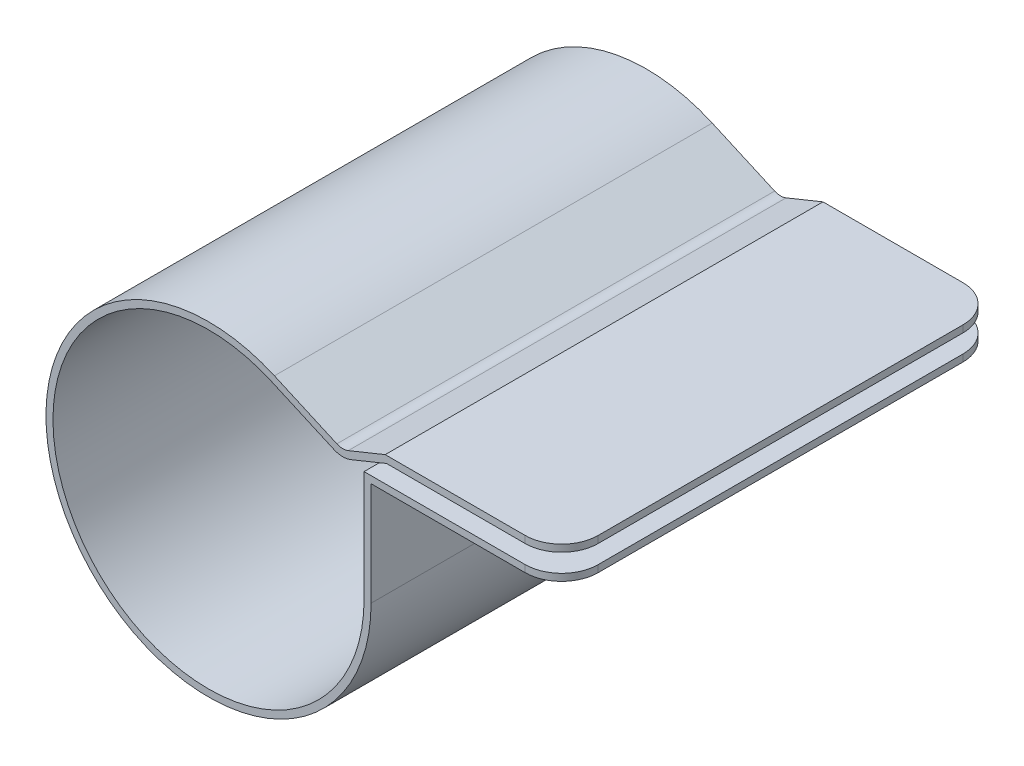
ISO-10303-21;
HEADER;
FILE_DESCRIPTION(('STEP AP214'),'2;1');
FILE_NAME('part.step','',(''),(''),'','','');
FILE_SCHEMA(('AUTOMOTIVE_DESIGN { 1 0 10303 214 1 1 1 1 }'));
ENDSEC;
DATA;
#1=APPLICATION_CONTEXT('core data for automotive mechanical design processes');
#2=APPLICATION_PROTOCOL_DEFINITION('international standard','automotive_design',2000,#1);
#3=PRODUCT_CONTEXT('',#1,'mechanical');
#4=PRODUCT('Part','Part','',(#3));
#5=PRODUCT_RELATED_PRODUCT_CATEGORY('part','',(#4));
#6=PRODUCT_DEFINITION_FORMATION('','',#4);
#7=PRODUCT_DEFINITION_CONTEXT('part definition',#1,'design');
#8=PRODUCT_DEFINITION('design','',#6,#7);
#9=PRODUCT_DEFINITION_SHAPE('','',#8);
#10=(LENGTH_UNIT() NAMED_UNIT(*) SI_UNIT(.MILLI.,.METRE.));
#11=(NAMED_UNIT(*) PLANE_ANGLE_UNIT() SI_UNIT($,.RADIAN.));
#12=(NAMED_UNIT(*) SI_UNIT($,.STERADIAN.) SOLID_ANGLE_UNIT());
#13=UNCERTAINTY_MEASURE_WITH_UNIT(LENGTH_MEASURE(1.E-05),#10,'distance_accuracy_value','');
#14=(GEOMETRIC_REPRESENTATION_CONTEXT(3) GLOBAL_UNCERTAINTY_ASSIGNED_CONTEXT((#13)) GLOBAL_UNIT_ASSIGNED_CONTEXT((#10,
#11,#12)) REPRESENTATION_CONTEXT('',''));
#15=CARTESIAN_POINT('',(0.,0.,0.));
#16=DIRECTION('',(0.,0.,1.));
#17=DIRECTION('',(1.,0.,0.));
#18=AXIS2_PLACEMENT_3D('',#15,#16,#17);
#19=CARTESIAN_POINT('',(0.,22.40534,76.2));
#20=DIRECTION('',(0.,1.,0.));
#21=DIRECTION('',(0.,0.,1.));
#22=AXIS2_PLACEMENT_3D('',#19,#20,#21);
#23=PLANE('',#22);
#24=DIRECTION('',(1.,0.,0.));
#25=VECTOR('',#24,1.);
#26=CARTESIAN_POINT('',(0.,22.40534,0.));
#27=LINE('',#26,#25);
#28=CARTESIAN_POINT('',(30.988,22.40534,0.));
#29=VERTEX_POINT('',#28);
#30=CARTESIAN_POINT('',(55.118,22.40534,0.));
#31=VERTEX_POINT('',#30);
#32=EDGE_CURVE('E236',#29,#31,#27,.T.);
#33=ORIENTED_EDGE('',*,*,#32,.T.);
#34=CARTESIAN_POINT('',(55.118,22.40534,6.34999999999999));
#35=DIRECTION('',(0.,1.,0.));
#36=DIRECTION('',(0.,0.,1.));
#37=AXIS2_PLACEMENT_3D('',#34,#35,#36);
#38=CIRCLE('',#37,6.35);
#39=CARTESIAN_POINT('',(61.468,22.40534,6.35000000000002));
#40=VERTEX_POINT('',#39);
#41=EDGE_CURVE('E319',#31,#40,#38,.F.);
#42=ORIENTED_EDGE('',*,*,#41,.T.);
#43=DIRECTION('',(0.,0.,-1.));
#44=VECTOR('',#43,1.);
#45=CARTESIAN_POINT('',(61.468,22.40534,76.2));
#46=LINE('',#45,#44);
#47=CARTESIAN_POINT('',(61.468,22.40534,69.85));
#48=VERTEX_POINT('',#47);
#49=EDGE_CURVE('E300',#48,#40,#46,.T.);
#50=ORIENTED_EDGE('',*,*,#49,.F.);
#51=CARTESIAN_POINT('',(55.118,22.40534,69.85));
#52=DIRECTION('',(0.,1.,0.));
#53=DIRECTION('',(0.,0.,1.));
#54=AXIS2_PLACEMENT_3D('',#51,#52,#53);
#55=CIRCLE('',#54,6.35);
#56=CARTESIAN_POINT('',(55.118,22.40534,76.2));
#57=VERTEX_POINT('',#56);
#58=EDGE_CURVE('E317',#48,#57,#55,.F.);
#59=ORIENTED_EDGE('',*,*,#58,.T.);
#60=DIRECTION('',(1.,0.,0.));
#61=VECTOR('',#60,1.);
#62=CARTESIAN_POINT('',(0.,22.40534,76.2));
#63=LINE('',#62,#61);
#64=CARTESIAN_POINT('',(30.988,22.40534,76.2));
#65=VERTEX_POINT('',#64);
#66=EDGE_CURVE('E204',#65,#57,#63,.T.);
#67=ORIENTED_EDGE('',*,*,#66,.F.);
#68=DIRECTION('',(0.,0.,-1.));
#69=VECTOR('',#68,1.);
#70=CARTESIAN_POINT('',(30.988,22.40534,76.2));
#71=LINE('',#70,#69);
#72=EDGE_CURVE('E235',#65,#29,#71,.T.);
#73=ORIENTED_EDGE('',*,*,#72,.T.);
#74=EDGE_LOOP('',(#33,#42,#50,#59,#67,#73));
#75=FACE_BOUND('',#74,.T.);
#76=ADVANCED_FACE('F43',(#75),#23,.F.);
#77=CARTESIAN_POINT('',(61.468,0.,76.2));
#78=DIRECTION('',(-1.,0.,0.));
#79=DIRECTION('',(0.,0.,1.));
#80=AXIS2_PLACEMENT_3D('',#77,#78,#79);
#81=PLANE('',#80);
#82=ORIENTED_EDGE('',*,*,#49,.T.);
#83=DIRECTION('',(0.,1.,0.));
#84=VECTOR('',#83,1.);
#85=CARTESIAN_POINT('',(61.468,0.,6.34999999999999));
#86=LINE('',#85,#84);
#87=CARTESIAN_POINT('',(61.468,23.62454,6.35000000000002));
#88=VERTEX_POINT('',#87);
#89=EDGE_CURVE('E305',#40,#88,#86,.T.);
#90=ORIENTED_EDGE('',*,*,#89,.T.);
#91=DIRECTION('',(0.,0.,-1.));
#92=VECTOR('',#91,1.);
#93=CARTESIAN_POINT('',(61.468,23.62454,76.2));
#94=LINE('',#93,#92);
#95=CARTESIAN_POINT('',(61.468,23.62454,69.85));
#96=VERTEX_POINT('',#95);
#97=EDGE_CURVE('E194',#96,#88,#94,.T.);
#98=ORIENTED_EDGE('',*,*,#97,.F.);
#99=DIRECTION('',(0.,1.,0.));
#100=VECTOR('',#99,1.);
#101=CARTESIAN_POINT('',(61.468,22.40534,69.85));
#102=LINE('',#101,#100);
#103=EDGE_CURVE('E303',#96,#48,#102,.F.);
#104=ORIENTED_EDGE('',*,*,#103,.T.);
#105=EDGE_LOOP('',(#82,#90,#98,#104));
#106=FACE_BOUND('',#105,.T.);
#107=ADVANCED_FACE('F377',(#106),#81,.F.);
#108=CARTESIAN_POINT('',(0.,23.62454,76.2));
#109=DIRECTION('',(0.,1.,0.));
#110=DIRECTION('',(0.,0.,1.));
#111=AXIS2_PLACEMENT_3D('',#108,#109,#110);
#112=PLANE('',#111);
#113=ORIENTED_EDGE('',*,*,#97,.T.);
#114=CARTESIAN_POINT('',(55.118,23.62454,6.34999999999999));
#115=DIRECTION('',(0.,1.,0.));
#116=DIRECTION('',(0.,0.,1.));
#117=AXIS2_PLACEMENT_3D('',#114,#115,#116);
#118=CIRCLE('',#117,6.35);
#119=CARTESIAN_POINT('',(55.118,23.62454,0.));
#120=VERTEX_POINT('',#119);
#121=EDGE_CURVE('E310',#88,#120,#118,.T.);
#122=ORIENTED_EDGE('',*,*,#121,.T.);
#123=DIRECTION('',(1.,0.,0.));
#124=VECTOR('',#123,1.);
#125=CARTESIAN_POINT('',(0.,23.62454,0.));
#126=LINE('',#125,#124);
#127=CARTESIAN_POINT('',(30.7498657014416,23.62454,0.));
#128=VERTEX_POINT('',#127);
#129=EDGE_CURVE('E189',#128,#120,#126,.T.);
#130=ORIENTED_EDGE('',*,*,#129,.F.);
#131=DIRECTION('',(0.,0.,-1.));
#132=VECTOR('',#131,1.);
#133=CARTESIAN_POINT('',(30.7498657014416,23.62454,76.2));
#134=LINE('',#133,#132);
#135=CARTESIAN_POINT('',(30.7498657014416,23.62454,76.2));
#136=VERTEX_POINT('',#135);
#137=EDGE_CURVE('E183',#136,#128,#134,.T.);
#138=ORIENTED_EDGE('',*,*,#137,.F.);
#139=DIRECTION('',(1.,0.,0.));
#140=VECTOR('',#139,1.);
#141=CARTESIAN_POINT('',(0.,23.62454,76.2));
#142=LINE('',#141,#140);
#143=CARTESIAN_POINT('',(55.118,23.62454,76.2));
#144=VERTEX_POINT('',#143);
#145=EDGE_CURVE('E187',#136,#144,#142,.T.);
#146=ORIENTED_EDGE('',*,*,#145,.T.);
#147=CARTESIAN_POINT('',(55.118,23.62454,69.85));
#148=DIRECTION('',(0.,1.,0.));
#149=DIRECTION('',(0.,0.,1.));
#150=AXIS2_PLACEMENT_3D('',#147,#148,#149);
#151=CIRCLE('',#150,6.35);
#152=EDGE_CURVE('E308',#144,#96,#151,.T.);
#153=ORIENTED_EDGE('',*,*,#152,.T.);
#154=EDGE_LOOP('',(#113,#122,#130,#138,#146,#153));
#155=FACE_BOUND('',#154,.T.);
#156=ADVANCED_FACE('F186',(#155),#112,.T.);
#157=CARTESIAN_POINT('',(-3.88232680921413,9.55922026532557,76.2));
#158=DIRECTION('',(-0.376284998923022,0.926503966308564,0.));
#159=DIRECTION('',(-0.926503966308564,-0.376284998923022,0.));
#160=AXIS2_PLACEMENT_3D('',#157,#158,#159);
#161=PLANE('',#160);
#162=DIRECTION('',(0.926503966308564,0.376284998923022,0.));
#163=VECTOR('',#162,1.);
#164=CARTESIAN_POINT('',(-3.88232680921413,9.55922026532557,0.));
#165=LINE('',#164,#163);
#166=CARTESIAN_POINT('',(24.3237638972645,21.0146799255762,0.));
#167=VERTEX_POINT('',#166);
#168=EDGE_CURVE('E240',#167,#128,#165,.T.);
#169=ORIENTED_EDGE('',*,*,#168,.F.);
#170=DIRECTION('',(0.,0.,-1.));
#171=VECTOR('',#170,1.);
#172=CARTESIAN_POINT('',(24.3237638972645,21.0146799255762,76.2));
#173=LINE('',#172,#171);
#174=CARTESIAN_POINT('',(24.3237638972645,21.0146799255762,76.2));
#175=VERTEX_POINT('',#174);
#176=EDGE_CURVE('E195',#175,#167,#173,.T.);
#177=ORIENTED_EDGE('',*,*,#176,.F.);
#178=DIRECTION('',(0.926503966308564,0.376284998923022,0.));
#179=VECTOR('',#178,1.);
#180=CARTESIAN_POINT('',(-3.88232680921413,9.55922026532557,76.2));
#181=LINE('',#180,#179);
#182=EDGE_CURVE('E201',#175,#136,#181,.T.);
#183=ORIENTED_EDGE('',*,*,#182,.T.);
#184=ORIENTED_EDGE('',*,*,#137,.T.);
#185=EDGE_LOOP('',(#169,#177,#183,#184));
#186=FACE_BOUND('',#185,.T.);
#187=ADVANCED_FACE('F206',(#186),#161,.T.);
#188=CARTESIAN_POINT('',(23.368,23.368,76.2));
#189=DIRECTION('',(0.,0.,-1.));
#190=DIRECTION('',(-1.,0.,0.));
#191=AXIS2_PLACEMENT_3D('',#188,#189,#190);
#192=CYLINDRICAL_SURFACE('',#191,2.54);
#193=CARTESIAN_POINT('',(23.368,23.368,0.));
#194=DIRECTION('',(0.,0.,1.));
#195=DIRECTION('',(1.,0.,0.));
#196=AXIS2_PLACEMENT_3D('',#193,#194,#195);
#197=CIRCLE('',#196,2.54);
#198=CARTESIAN_POINT('',(22.3381661550308,21.0461381927953,0.));
#199=VERTEX_POINT('',#198);
#200=EDGE_CURVE('E242',#199,#167,#197,.T.);
#201=ORIENTED_EDGE('',*,*,#200,.F.);
#202=DIRECTION('',(0.,0.,-1.));
#203=VECTOR('',#202,1.);
#204=CARTESIAN_POINT('',(22.3381661550308,21.0461381927953,76.2));
#205=LINE('',#204,#203);
#206=CARTESIAN_POINT('',(22.3381661550308,21.0461381927953,76.2));
#207=VERTEX_POINT('',#206);
#208=EDGE_CURVE('E296',#207,#199,#205,.T.);
#209=ORIENTED_EDGE('',*,*,#208,.F.);
#210=CARTESIAN_POINT('',(23.368,23.368,76.2));
#211=DIRECTION('',(0.,0.,1.));
#212=DIRECTION('',(1.,0.,0.));
#213=AXIS2_PLACEMENT_3D('',#210,#211,#212);
#214=CIRCLE('',#213,2.54);
#215=EDGE_CURVE('E207',#207,#175,#214,.T.);
#216=ORIENTED_EDGE('',*,*,#215,.T.);
#217=ORIENTED_EDGE('',*,*,#176,.T.);
#218=EDGE_LOOP('',(#201,#209,#216,#217));
#219=FACE_BOUND('',#218,.T.);
#220=ADVANCED_FACE('F366',(#219),#192,.F.);
#221=CARTESIAN_POINT('',(11.4723490329569,25.8655405322606,76.2));
#222=DIRECTION('',(0.405446395657165,0.91411882173414,0.));
#223=DIRECTION('',(-0.914118821734141,0.405446395657165,0.));
#224=AXIS2_PLACEMENT_3D('',#221,#222,#223);
#225=PLANE('',#224);
#226=DIRECTION('',(0.914118821734141,-0.405446395657165,0.));
#227=VECTOR('',#226,1.);
#228=CARTESIAN_POINT('',(11.4723490329569,25.8655405322606,0.));
#229=LINE('',#228,#227);
#230=CARTESIAN_POINT('',(11.4723490329569,25.8655405322606,0.));
#231=VERTEX_POINT('',#230);
#232=EDGE_CURVE('E245',#231,#199,#229,.T.);
#233=ORIENTED_EDGE('',*,*,#232,.F.);
#234=DIRECTION('',(0.,0.,-1.));
#235=VECTOR('',#234,1.);
#236=CARTESIAN_POINT('',(11.4723490329569,25.8655405322606,76.2));
#237=LINE('',#236,#235);
#238=CARTESIAN_POINT('',(11.4723490329569,25.8655405322606,76.2));
#239=VERTEX_POINT('',#238);
#240=EDGE_CURVE('E294',#239,#231,#237,.T.);
#241=ORIENTED_EDGE('',*,*,#240,.F.);
#242=DIRECTION('',(0.914118821734141,-0.405446395657165,0.));
#243=VECTOR('',#242,1.);
#244=CARTESIAN_POINT('',(11.4723490329569,25.8655405322606,76.2));
#245=LINE('',#244,#243);
#246=EDGE_CURVE('E209',#239,#207,#245,.T.);
#247=ORIENTED_EDGE('',*,*,#246,.T.);
#248=ORIENTED_EDGE('',*,*,#208,.T.);
#249=EDGE_LOOP('',(#233,#241,#247,#248));
#250=FACE_BOUND('',#249,.T.);
#251=ADVANCED_FACE('F363',(#250),#225,.T.);
#252=CARTESIAN_POINT('',(0.,0.,76.2));
#253=DIRECTION('',(0.,0.,-1.));
#254=DIRECTION('',(-1.,0.,0.));
#255=AXIS2_PLACEMENT_3D('',#252,#253,#254);
#256=CYLINDRICAL_SURFACE('',#255,28.2956);
#257=CARTESIAN_POINT('',(0.,0.,0.));
#258=DIRECTION('',(0.,0.,1.));
#259=DIRECTION('',(1.,0.,0.));
#260=AXIS2_PLACEMENT_3D('',#257,#258,#259);
#261=CIRCLE('',#260,28.2956);
#262=CARTESIAN_POINT('',(28.2956,0.,0.));
#263=VERTEX_POINT('',#262);
#264=EDGE_CURVE('E248',#231,#263,#261,.T.);
#265=ORIENTED_EDGE('',*,*,#264,.T.);
#266=DIRECTION('',(0.,0.,-1.));
#267=VECTOR('',#266,1.);
#268=CARTESIAN_POINT('',(28.2956,0.,76.2));
#269=LINE('',#268,#267);
#270=CARTESIAN_POINT('',(28.2956,0.,76.2));
#271=VERTEX_POINT('',#270);
#272=EDGE_CURVE('E291',#271,#263,#269,.T.);
#273=ORIENTED_EDGE('',*,*,#272,.F.);
#274=CARTESIAN_POINT('',(0.,0.,76.2));
#275=DIRECTION('',(0.,0.,1.));
#276=DIRECTION('',(1.,0.,0.));
#277=AXIS2_PLACEMENT_3D('',#274,#275,#276);
#278=CIRCLE('',#277,28.2956);
#279=EDGE_CURVE('E215',#239,#271,#278,.T.);
#280=ORIENTED_EDGE('',*,*,#279,.F.);
#281=ORIENTED_EDGE('',*,*,#240,.T.);
#282=EDGE_LOOP('',(#265,#273,#280,#281));
#283=FACE_BOUND('',#282,.T.);
#284=ADVANCED_FACE('F565',(#283),#256,.T.);
#285=CARTESIAN_POINT('',(28.2956,0.,76.2));
#286=DIRECTION('',(-1.,0.,0.));
#287=DIRECTION('',(0.,0.,1.));
#288=AXIS2_PLACEMENT_3D('',#285,#286,#287);
#289=PLANE('',#288);
#290=DIRECTION('',(0.,1.,0.));
#291=VECTOR('',#290,1.);
#292=CARTESIAN_POINT('',(28.2956,0.,0.));
#293=LINE('',#292,#291);
#294=CARTESIAN_POINT('',(28.2956,18.01114,0.));
#295=VERTEX_POINT('',#294);
#296=EDGE_CURVE('E250',#263,#295,#293,.T.);
#297=ORIENTED_EDGE('',*,*,#296,.T.);
#298=DIRECTION('',(0.,0.,-1.));
#299=VECTOR('',#298,1.);
#300=CARTESIAN_POINT('',(28.2956,18.01114,76.2));
#301=LINE('',#300,#299);
#302=CARTESIAN_POINT('',(28.2956,18.01114,76.2));
#303=VERTEX_POINT('',#302);
#304=EDGE_CURVE('E288',#303,#295,#301,.T.);
#305=ORIENTED_EDGE('',*,*,#304,.F.);
#306=DIRECTION('',(0.,1.,0.));
#307=VECTOR('',#306,1.);
#308=CARTESIAN_POINT('',(28.2956,0.,76.2));
#309=LINE('',#308,#307);
#310=EDGE_CURVE('E217',#271,#303,#309,.T.);
#311=ORIENTED_EDGE('',*,*,#310,.F.);
#312=ORIENTED_EDGE('',*,*,#272,.T.);
#313=EDGE_LOOP('',(#297,#305,#311,#312));
#314=FACE_BOUND('',#313,.T.);
#315=ADVANCED_FACE('F357',(#314),#289,.F.);
#316=CARTESIAN_POINT('',(0.,18.01114,76.2));
#317=DIRECTION('',(0.,1.,0.));
#318=DIRECTION('',(0.,0.,1.));
#319=AXIS2_PLACEMENT_3D('',#316,#317,#318);
#320=PLANE('',#319);
#321=DIRECTION('',(1.,0.,0.));
#322=VECTOR('',#321,1.);
#323=CARTESIAN_POINT('',(0.,18.01114,0.));
#324=LINE('',#323,#322);
#325=CARTESIAN_POINT('',(55.118,18.01114,0.));
#326=VERTEX_POINT('',#325);
#327=EDGE_CURVE('E252',#295,#326,#324,.T.);
#328=ORIENTED_EDGE('',*,*,#327,.T.);
#329=CARTESIAN_POINT('',(55.118,18.01114,6.35));
#330=DIRECTION('',(0.,1.,0.));
#331=DIRECTION('',(0.,0.,1.));
#332=AXIS2_PLACEMENT_3D('',#329,#330,#331);
#333=CIRCLE('',#332,6.35);
#334=CARTESIAN_POINT('',(61.468,18.01114,6.35000000000002));
#335=VERTEX_POINT('',#334);
#336=EDGE_CURVE('E323',#326,#335,#333,.F.);
#337=ORIENTED_EDGE('',*,*,#336,.T.);
#338=DIRECTION('',(0.,0.,-1.));
#339=VECTOR('',#338,1.);
#340=CARTESIAN_POINT('',(61.468,18.01114,76.2));
#341=LINE('',#340,#339);
#342=CARTESIAN_POINT('',(61.468,18.01114,69.85));
#343=VERTEX_POINT('',#342);
#344=EDGE_CURVE('E286',#343,#335,#341,.T.);
#345=ORIENTED_EDGE('',*,*,#344,.F.);
#346=CARTESIAN_POINT('',(55.118,18.01114,69.85));
#347=DIRECTION('',(0.,1.,0.));
#348=DIRECTION('',(0.,0.,1.));
#349=AXIS2_PLACEMENT_3D('',#346,#347,#348);
#350=CIRCLE('',#349,6.35);
#351=CARTESIAN_POINT('',(55.118,18.01114,76.2));
#352=VERTEX_POINT('',#351);
#353=EDGE_CURVE('E321',#343,#352,#350,.F.);
#354=ORIENTED_EDGE('',*,*,#353,.T.);
#355=DIRECTION('',(1.,0.,0.));
#356=VECTOR('',#355,1.);
#357=CARTESIAN_POINT('',(0.,18.01114,76.2));
#358=LINE('',#357,#356);
#359=EDGE_CURVE('E219',#303,#352,#358,.T.);
#360=ORIENTED_EDGE('',*,*,#359,.F.);
#361=ORIENTED_EDGE('',*,*,#304,.T.);
#362=EDGE_LOOP('',(#328,#337,#345,#354,#360,#361));
#363=FACE_BOUND('',#362,.T.);
#364=ADVANCED_FACE('F345',(#363),#320,.F.);
#365=CARTESIAN_POINT('',(61.468,0.,76.2));
#366=DIRECTION('',(1.,0.,0.));
#367=DIRECTION('',(0.,0.,-1.));
#368=AXIS2_PLACEMENT_3D('',#365,#366,#367);
#369=PLANE('',#368);
#370=ORIENTED_EDGE('',*,*,#344,.T.);
#371=DIRECTION('',(0.,-1.,0.));
#372=VECTOR('',#371,1.);
#373=CARTESIAN_POINT('',(61.468,19.23034,6.35));
#374=LINE('',#373,#372);
#375=CARTESIAN_POINT('',(61.468,19.23034,6.35000000000002));
#376=VERTEX_POINT('',#375);
#377=EDGE_CURVE('E65',#335,#376,#374,.F.);
#378=ORIENTED_EDGE('',*,*,#377,.T.);
#379=DIRECTION('',(0.,0.,-1.));
#380=VECTOR('',#379,1.);
#381=CARTESIAN_POINT('',(61.468,19.23034,76.2));
#382=LINE('',#381,#380);
#383=CARTESIAN_POINT('',(61.468,19.23034,69.85));
#384=VERTEX_POINT('',#383);
#385=EDGE_CURVE('E284',#384,#376,#382,.T.);
#386=ORIENTED_EDGE('',*,*,#385,.F.);
#387=DIRECTION('',(0.,-1.,0.));
#388=VECTOR('',#387,1.);
#389=CARTESIAN_POINT('',(61.468,0.,69.85));
#390=LINE('',#389,#388);
#391=EDGE_CURVE('E325',#384,#343,#390,.T.);
#392=ORIENTED_EDGE('',*,*,#391,.T.);
#393=EDGE_LOOP('',(#370,#378,#386,#392));
#394=FACE_BOUND('',#393,.T.);
#395=ADVANCED_FACE('F346',(#394),#369,.T.);
#396=CARTESIAN_POINT('',(0.,19.23034,76.2));
#397=DIRECTION('',(0.,1.,0.));
#398=DIRECTION('',(0.,0.,1.));
#399=AXIS2_PLACEMENT_3D('',#396,#397,#398);
#400=PLANE('',#399);
#401=ORIENTED_EDGE('',*,*,#385,.T.);
#402=CARTESIAN_POINT('',(55.118,19.23034,6.35));
#403=DIRECTION('',(0.,1.,0.));
#404=DIRECTION('',(0.,0.,1.));
#405=AXIS2_PLACEMENT_3D('',#402,#403,#404);
#406=CIRCLE('',#405,6.35);
#407=CARTESIAN_POINT('',(55.118,19.23034,0.));
#408=VERTEX_POINT('',#407);
#409=EDGE_CURVE('E331',#376,#408,#406,.T.);
#410=ORIENTED_EDGE('',*,*,#409,.T.);
#411=DIRECTION('',(1.,0.,0.));
#412=VECTOR('',#411,1.);
#413=CARTESIAN_POINT('',(0.,19.23034,0.));
#414=LINE('',#413,#412);
#415=CARTESIAN_POINT('',(27.0764,19.23034,0.));
#416=VERTEX_POINT('',#415);
#417=EDGE_CURVE('E255',#416,#408,#414,.T.);
#418=ORIENTED_EDGE('',*,*,#417,.F.);
#419=DIRECTION('',(0.,0.,-1.));
#420=VECTOR('',#419,1.);
#421=CARTESIAN_POINT('',(27.0764,19.23034,76.2));
#422=LINE('',#421,#420);
#423=CARTESIAN_POINT('',(27.0764,19.23034,76.2));
#424=VERTEX_POINT('',#423);
#425=EDGE_CURVE('E282',#424,#416,#422,.T.);
#426=ORIENTED_EDGE('',*,*,#425,.F.);
#427=DIRECTION('',(1.,0.,0.));
#428=VECTOR('',#427,1.);
#429=CARTESIAN_POINT('',(0.,19.23034,76.2));
#430=LINE('',#429,#428);
#431=CARTESIAN_POINT('',(55.118,19.23034,76.2));
#432=VERTEX_POINT('',#431);
#433=EDGE_CURVE('E221',#424,#432,#430,.T.);
#434=ORIENTED_EDGE('',*,*,#433,.T.);
#435=CARTESIAN_POINT('',(55.118,19.23034,69.85));
#436=DIRECTION('',(0.,1.,0.));
#437=DIRECTION('',(0.,0.,1.));
#438=AXIS2_PLACEMENT_3D('',#435,#436,#437);
#439=CIRCLE('',#438,6.35);
#440=EDGE_CURVE('E329',#432,#384,#439,.T.);
#441=ORIENTED_EDGE('',*,*,#440,.T.);
#442=EDGE_LOOP('',(#401,#410,#418,#426,#434,#441));
#443=FACE_BOUND('',#442,.T.);
#444=ADVANCED_FACE('F335',(#443),#400,.T.);
#445=CARTESIAN_POINT('',(27.0764,0.,76.2));
#446=DIRECTION('',(-1.,0.,0.));
#447=DIRECTION('',(0.,0.,1.));
#448=AXIS2_PLACEMENT_3D('',#445,#446,#447);
#449=PLANE('',#448);
#450=DIRECTION('',(0.,1.,0.));
#451=VECTOR('',#450,1.);
#452=CARTESIAN_POINT('',(27.0764,0.,0.));
#453=LINE('',#452,#451);
#454=CARTESIAN_POINT('',(27.0764,0.,0.));
#455=VERTEX_POINT('',#454);
#456=EDGE_CURVE('E258',#455,#416,#453,.T.);
#457=ORIENTED_EDGE('',*,*,#456,.F.);
#458=DIRECTION('',(0.,0.,-1.));
#459=VECTOR('',#458,1.);
#460=CARTESIAN_POINT('',(27.0764,0.,76.2));
#461=LINE('',#460,#459);
#462=CARTESIAN_POINT('',(27.0764,0.,76.2));
#463=VERTEX_POINT('',#462);
#464=EDGE_CURVE('E280',#463,#455,#461,.T.);
#465=ORIENTED_EDGE('',*,*,#464,.F.);
#466=DIRECTION('',(0.,1.,0.));
#467=VECTOR('',#466,1.);
#468=CARTESIAN_POINT('',(27.0764,0.,76.2));
#469=LINE('',#468,#467);
#470=EDGE_CURVE('E223',#463,#424,#469,.T.);
#471=ORIENTED_EDGE('',*,*,#470,.T.);
#472=ORIENTED_EDGE('',*,*,#425,.T.);
#473=EDGE_LOOP('',(#457,#465,#471,#472));
#474=FACE_BOUND('',#473,.T.);
#475=ADVANCED_FACE('F404',(#474),#449,.T.);
#476=CARTESIAN_POINT('',(0.,0.,76.2));
#477=DIRECTION('',(0.,0.,-1.));
#478=DIRECTION('',(-1.,0.,0.));
#479=AXIS2_PLACEMENT_3D('',#476,#477,#478);
#480=CYLINDRICAL_SURFACE('',#479,27.0764);
#481=CARTESIAN_POINT('',(0.,0.,0.));
#482=DIRECTION('',(0.,0.,1.));
#483=DIRECTION('',(1.,0.,0.));
#484=AXIS2_PLACEMENT_3D('',#481,#482,#483);
#485=CIRCLE('',#484,27.0764);
#486=CARTESIAN_POINT('',(10.9780287873717,24.7510468648023,0.));
#487=VERTEX_POINT('',#486);
#488=EDGE_CURVE('E261',#487,#455,#485,.T.);
#489=ORIENTED_EDGE('',*,*,#488,.F.);
#490=DIRECTION('',(0.,0.,-1.));
#491=VECTOR('',#490,1.);
#492=CARTESIAN_POINT('',(10.9780287873717,24.7510468648023,76.2));
#493=LINE('',#492,#491);
#494=CARTESIAN_POINT('',(10.9780287873717,24.7510468648023,76.2));
#495=VERTEX_POINT('',#494);
#496=EDGE_CURVE('E278',#495,#487,#493,.T.);
#497=ORIENTED_EDGE('',*,*,#496,.F.);
#498=CARTESIAN_POINT('',(0.,0.,76.2));
#499=DIRECTION('',(0.,0.,1.));
#500=DIRECTION('',(1.,0.,0.));
#501=AXIS2_PLACEMENT_3D('',#498,#499,#500);
#502=CIRCLE('',#501,27.0764);
#503=EDGE_CURVE('E226',#495,#463,#502,.T.);
#504=ORIENTED_EDGE('',*,*,#503,.T.);
#505=ORIENTED_EDGE('',*,*,#464,.T.);
#506=EDGE_LOOP('',(#489,#497,#504,#505));
#507=FACE_BOUND('',#506,.T.);
#508=ADVANCED_FACE('F401',(#507),#480,.F.);
#509=CARTESIAN_POINT('',(10.9780287873717,24.7510468648023,76.2));
#510=DIRECTION('',(0.405446395657165,0.91411882173414,0.));
#511=DIRECTION('',(-0.91411882173414,0.405446395657165,0.));
#512=AXIS2_PLACEMENT_3D('',#509,#510,#511);
#513=PLANE('',#512);
#514=DIRECTION('',(0.91411882173414,-0.405446395657165,0.));
#515=VECTOR('',#514,1.);
#516=CARTESIAN_POINT('',(10.9780287873717,24.7510468648023,0.));
#517=LINE('',#516,#515);
#518=CARTESIAN_POINT('',(21.8438459094456,19.931644525337,0.));
#519=VERTEX_POINT('',#518);
#520=EDGE_CURVE('E264',#487,#519,#517,.T.);
#521=ORIENTED_EDGE('',*,*,#520,.T.);
#522=DIRECTION('',(0.,0.,-1.));
#523=VECTOR('',#522,1.);
#524=CARTESIAN_POINT('',(21.8438459094456,19.931644525337,76.2));
#525=LINE('',#524,#523);
#526=CARTESIAN_POINT('',(21.8438459094456,19.931644525337,76.2));
#527=VERTEX_POINT('',#526);
#528=EDGE_CURVE('E275',#527,#519,#525,.T.);
#529=ORIENTED_EDGE('',*,*,#528,.F.);
#530=DIRECTION('',(0.91411882173414,-0.405446395657165,0.));
#531=VECTOR('',#530,1.);
#532=CARTESIAN_POINT('',(10.9780287873717,24.7510468648023,76.2));
#533=LINE('',#532,#531);
#534=EDGE_CURVE('E229',#495,#527,#533,.T.);
#535=ORIENTED_EDGE('',*,*,#534,.F.);
#536=ORIENTED_EDGE('',*,*,#496,.T.);
#537=EDGE_LOOP('',(#521,#529,#535,#536));
#538=FACE_BOUND('',#537,.T.);
#539=ADVANCED_FACE('F398',(#538),#513,.F.);
#540=CARTESIAN_POINT('',(23.368,23.368,76.2));
#541=DIRECTION('',(0.,0.,-1.));
#542=DIRECTION('',(-1.,0.,0.));
#543=AXIS2_PLACEMENT_3D('',#540,#541,#542);
#544=CYLINDRICAL_SURFACE('',#543,3.7592);
#545=CARTESIAN_POINT('',(23.368,23.368,0.));
#546=DIRECTION('',(0.,0.,1.));
#547=DIRECTION('',(1.,0.,0.));
#548=AXIS2_PLACEMENT_3D('',#545,#546,#547);
#549=CIRCLE('',#548,3.7592);
#550=CARTESIAN_POINT('',(24.7825305679514,19.8850862898528,0.));
#551=VERTEX_POINT('',#550);
#552=EDGE_CURVE('E266',#519,#551,#549,.T.);
#553=ORIENTED_EDGE('',*,*,#552,.T.);
#554=DIRECTION('',(0.,0.,-1.));
#555=VECTOR('',#554,1.);
#556=CARTESIAN_POINT('',(24.7825305679514,19.8850862898528,76.2));
#557=LINE('',#556,#555);
#558=CARTESIAN_POINT('',(24.7825305679514,19.8850862898528,76.2));
#559=VERTEX_POINT('',#558);
#560=EDGE_CURVE('E272',#559,#551,#557,.T.);
#561=ORIENTED_EDGE('',*,*,#560,.F.);
#562=CARTESIAN_POINT('',(23.368,23.368,76.2));
#563=DIRECTION('',(0.,0.,1.));
#564=DIRECTION('',(1.,0.,0.));
#565=AXIS2_PLACEMENT_3D('',#562,#563,#564);
#566=CIRCLE('',#565,3.7592);
#567=EDGE_CURVE('E231',#527,#559,#566,.T.);
#568=ORIENTED_EDGE('',*,*,#567,.F.);
#569=ORIENTED_EDGE('',*,*,#528,.T.);
#570=EDGE_LOOP('',(#553,#561,#568,#569));
#571=FACE_BOUND('',#570,.T.);
#572=ADVANCED_FACE('F394',(#571),#544,.T.);
#573=CARTESIAN_POINT('',(-3.42356013852718,8.42962662960217,76.2));
#574=DIRECTION('',(-0.376284998923022,0.926503966308564,0.));
#575=DIRECTION('',(-0.926503966308564,-0.376284998923022,0.));
#576=AXIS2_PLACEMENT_3D('',#573,#574,#575);
#577=PLANE('',#576);
#578=DIRECTION('',(0.926503966308564,0.376284998923022,0.));
#579=VECTOR('',#578,1.);
#580=CARTESIAN_POINT('',(-3.42356013852718,8.42962662960217,0.));
#581=LINE('',#580,#579);
#582=EDGE_CURVE('E268',#551,#29,#581,.T.);
#583=ORIENTED_EDGE('',*,*,#582,.T.);
#584=ORIENTED_EDGE('',*,*,#72,.F.);
#585=DIRECTION('',(0.926503966308564,0.376284998923022,0.));
#586=VECTOR('',#585,1.);
#587=CARTESIAN_POINT('',(-3.42356013852718,8.42962662960217,76.2));
#588=LINE('',#587,#586);
#589=EDGE_CURVE('E233',#559,#65,#588,.T.);
#590=ORIENTED_EDGE('',*,*,#589,.F.);
#591=ORIENTED_EDGE('',*,*,#560,.T.);
#592=EDGE_LOOP('',(#583,#584,#590,#591));
#593=FACE_BOUND('',#592,.T.);
#594=ADVANCED_FACE('F388',(#593),#577,.F.);
#595=CARTESIAN_POINT('',(0.,0.,76.2));
#596=DIRECTION('',(0.,0.,1.));
#597=DIRECTION('',(1.,0.,0.));
#598=AXIS2_PLACEMENT_3D('',#595,#596,#597);
#599=PLANE('',#598);
#600=ORIENTED_EDGE('',*,*,#66,.T.);
#601=DIRECTION('',(0.,1.,0.));
#602=VECTOR('',#601,1.);
#603=CARTESIAN_POINT('',(55.118,23.62454,76.2));
#604=LINE('',#603,#602);
#605=EDGE_CURVE('E11',#57,#144,#604,.T.);
#606=ORIENTED_EDGE('',*,*,#605,.T.);
#607=ORIENTED_EDGE('',*,*,#145,.F.);
#608=ORIENTED_EDGE('',*,*,#182,.F.);
#609=ORIENTED_EDGE('',*,*,#215,.F.);
#610=ORIENTED_EDGE('',*,*,#246,.F.);
#611=ORIENTED_EDGE('',*,*,#279,.T.);
#612=ORIENTED_EDGE('',*,*,#310,.T.);
#613=ORIENTED_EDGE('',*,*,#359,.T.);
#614=DIRECTION('',(0.,-1.,0.));
#615=VECTOR('',#614,1.);
#616=CARTESIAN_POINT('',(55.118,0.,76.2));
#617=LINE('',#616,#615);
#618=EDGE_CURVE('E51',#352,#432,#617,.F.);
#619=ORIENTED_EDGE('',*,*,#618,.T.);
#620=ORIENTED_EDGE('',*,*,#433,.F.);
#621=ORIENTED_EDGE('',*,*,#470,.F.);
#622=ORIENTED_EDGE('',*,*,#503,.F.);
#623=ORIENTED_EDGE('',*,*,#534,.T.);
#624=ORIENTED_EDGE('',*,*,#567,.T.);
#625=ORIENTED_EDGE('',*,*,#589,.T.);
#626=EDGE_LOOP('',(#600,#606,#607,#608,#609,#610,#611,#612,#613,#619,#620,#621,#622,#623,#624,#625));
#627=FACE_BOUND('',#626,.T.);
#628=ADVANCED_FACE('F199',(#627),#599,.T.);
#629=CARTESIAN_POINT('',(0.,0.,0.));
#630=DIRECTION('',(0.,0.,1.));
#631=DIRECTION('',(1.,0.,0.));
#632=AXIS2_PLACEMENT_3D('',#629,#630,#631);
#633=PLANE('',#632);
#634=ORIENTED_EDGE('',*,*,#129,.T.);
#635=DIRECTION('',(0.,1.,0.));
#636=VECTOR('',#635,1.);
#637=CARTESIAN_POINT('',(55.118,0.,0.));
#638=LINE('',#637,#636);
#639=EDGE_CURVE('E315',#120,#31,#638,.F.);
#640=ORIENTED_EDGE('',*,*,#639,.T.);
#641=ORIENTED_EDGE('',*,*,#32,.F.);
#642=ORIENTED_EDGE('',*,*,#582,.F.);
#643=ORIENTED_EDGE('',*,*,#552,.F.);
#644=ORIENTED_EDGE('',*,*,#520,.F.);
#645=ORIENTED_EDGE('',*,*,#488,.T.);
#646=ORIENTED_EDGE('',*,*,#456,.T.);
#647=ORIENTED_EDGE('',*,*,#417,.T.);
#648=DIRECTION('',(0.,-1.,0.));
#649=VECTOR('',#648,1.);
#650=CARTESIAN_POINT('',(55.118,18.01114,0.));
#651=LINE('',#650,#649);
#652=EDGE_CURVE('E312',#408,#326,#651,.T.);
#653=ORIENTED_EDGE('',*,*,#652,.T.);
#654=ORIENTED_EDGE('',*,*,#327,.F.);
#655=ORIENTED_EDGE('',*,*,#296,.F.);
#656=ORIENTED_EDGE('',*,*,#264,.F.);
#657=ORIENTED_EDGE('',*,*,#232,.T.);
#658=ORIENTED_EDGE('',*,*,#200,.T.);
#659=ORIENTED_EDGE('',*,*,#168,.T.);
#660=EDGE_LOOP('',(#634,#640,#641,#642,#643,#644,#645,#646,#647,#653,#654,#655,#656,#657,#658,#659));
#661=FACE_BOUND('',#660,.T.);
#662=ADVANCED_FACE('F339',(#661),#633,.F.);
#663=CARTESIAN_POINT('',(55.118,0.,6.34999999999999));
#664=DIRECTION('',(0.,1.,0.));
#665=DIRECTION('',(0.,0.,1.));
#666=AXIS2_PLACEMENT_3D('',#663,#664,#665);
#667=CYLINDRICAL_SURFACE('',#666,6.35);
#668=ORIENTED_EDGE('',*,*,#41,.F.);
#669=ORIENTED_EDGE('',*,*,#639,.F.);
#670=ORIENTED_EDGE('',*,*,#121,.F.);
#671=ORIENTED_EDGE('',*,*,#89,.F.);
#672=EDGE_LOOP('',(#668,#669,#670,#671));
#673=FACE_BOUND('',#672,.T.);
#674=ADVANCED_FACE('F371',(#673),#667,.T.);
#675=CARTESIAN_POINT('',(55.118,0.,6.35));
#676=DIRECTION('',(0.,1.,0.));
#677=DIRECTION('',(0.,0.,1.));
#678=AXIS2_PLACEMENT_3D('',#675,#676,#677);
#679=CYLINDRICAL_SURFACE('',#678,6.35);
#680=ORIENTED_EDGE('',*,*,#409,.F.);
#681=ORIENTED_EDGE('',*,*,#377,.F.);
#682=ORIENTED_EDGE('',*,*,#336,.F.);
#683=ORIENTED_EDGE('',*,*,#652,.F.);
#684=EDGE_LOOP('',(#680,#681,#682,#683));
#685=FACE_BOUND('',#684,.T.);
#686=ADVANCED_FACE('F342',(#685),#679,.T.);
#687=CARTESIAN_POINT('',(55.118,0.,69.85));
#688=DIRECTION('',(0.,-1.,0.));
#689=DIRECTION('',(0.,0.,-1.));
#690=AXIS2_PLACEMENT_3D('',#687,#688,#689);
#691=CYLINDRICAL_SURFACE('',#690,6.35);
#692=ORIENTED_EDGE('',*,*,#58,.F.);
#693=ORIENTED_EDGE('',*,*,#103,.F.);
#694=ORIENTED_EDGE('',*,*,#152,.F.);
#695=ORIENTED_EDGE('',*,*,#605,.F.);
#696=EDGE_LOOP('',(#692,#693,#694,#695));
#697=FACE_BOUND('',#696,.T.);
#698=ADVANCED_FACE('F381',(#697),#691,.T.);
#699=CARTESIAN_POINT('',(55.118,0.,69.85));
#700=DIRECTION('',(0.,-1.,0.));
#701=DIRECTION('',(0.,0.,-1.));
#702=AXIS2_PLACEMENT_3D('',#699,#700,#701);
#703=CYLINDRICAL_SURFACE('',#702,6.35);
#704=ORIENTED_EDGE('',*,*,#440,.F.);
#705=ORIENTED_EDGE('',*,*,#618,.F.);
#706=ORIENTED_EDGE('',*,*,#353,.F.);
#707=ORIENTED_EDGE('',*,*,#391,.F.);
#708=EDGE_LOOP('',(#704,#705,#706,#707));
#709=FACE_BOUND('',#708,.T.);
#710=ADVANCED_FACE('F45',(#709),#703,.T.);
#711=CLOSED_SHELL('',(#76,#107,#156,#187,#220,#251,#284,#315,#364,#395,#444,#475,#508,#539,#572,
#594,#628,#662,#674,#686,#698,#710));
#712=MANIFOLD_SOLID_BREP('B2',#711);
#713=ADVANCED_BREP_SHAPE_REPRESENTATION('',(#18,#712),#14);
#714=SHAPE_DEFINITION_REPRESENTATION(#9,#713);
ENDSEC;
END-ISO-10303-21;
